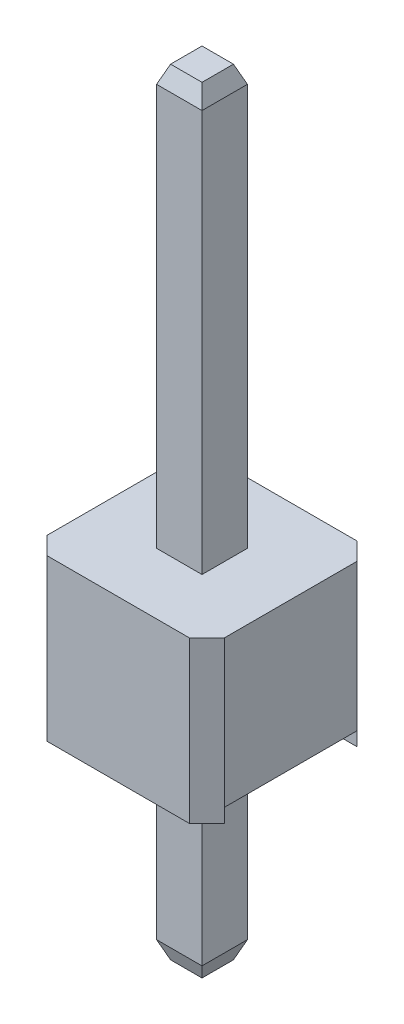
ISO-10303-21;
HEADER;
FILE_DESCRIPTION(('STEP AP214'),'2;1');
FILE_NAME('part.step','',(''),(''),'','','');
FILE_SCHEMA(('AUTOMOTIVE_DESIGN { 1 0 10303 214 1 1 1 1 }'));
ENDSEC;
DATA;
#1=APPLICATION_CONTEXT('core data for automotive mechanical design processes');
#2=APPLICATION_PROTOCOL_DEFINITION('international standard','automotive_design',2000,#1);
#3=PRODUCT_CONTEXT('',#1,'mechanical');
#4=PRODUCT('Part','Part','',(#3));
#5=PRODUCT_RELATED_PRODUCT_CATEGORY('part','',(#4));
#6=PRODUCT_DEFINITION_FORMATION('','',#4);
#7=PRODUCT_DEFINITION_CONTEXT('part definition',#1,'design');
#8=PRODUCT_DEFINITION('design','',#6,#7);
#9=PRODUCT_DEFINITION_SHAPE('','',#8);
#10=(LENGTH_UNIT() NAMED_UNIT(*) SI_UNIT(.MILLI.,.METRE.));
#11=(NAMED_UNIT(*) PLANE_ANGLE_UNIT() SI_UNIT($,.RADIAN.));
#12=(NAMED_UNIT(*) SI_UNIT($,.STERADIAN.) SOLID_ANGLE_UNIT());
#13=UNCERTAINTY_MEASURE_WITH_UNIT(LENGTH_MEASURE(1.E-05),#10,'distance_accuracy_value','');
#14=(GEOMETRIC_REPRESENTATION_CONTEXT(3) GLOBAL_UNCERTAINTY_ASSIGNED_CONTEXT((#13)) GLOBAL_UNIT_ASSIGNED_CONTEXT((#10,
#11,#12)) REPRESENTATION_CONTEXT('',''));
#15=CARTESIAN_POINT('',(0.,0.,0.));
#16=DIRECTION('',(0.,0.,1.));
#17=DIRECTION('',(1.,0.,0.));
#18=AXIS2_PLACEMENT_3D('',#15,#16,#17);
#19=CARTESIAN_POINT('',(-4.405,3.2,1.275));
#20=DIRECTION('',(0.,1.,0.));
#21=DIRECTION('',(0.,0.,1.));
#22=AXIS2_PLACEMENT_3D('',#19,#20,#21);
#23=PLANE('',#22);
#24=DIRECTION('',(0.,0.,-1.));
#25=VECTOR('',#24,1.);
#26=CARTESIAN_POINT('',(-0.945,3.2,-0.875));
#27=LINE('',#26,#25);
#28=CARTESIAN_POINT('',(-0.945000000000002,3.2,1.275));
#29=VERTEX_POINT('',#28);
#30=CARTESIAN_POINT('',(-0.945000000000005,3.2,-0.624999999999996));
#31=VERTEX_POINT('',#30);
#32=EDGE_CURVE('E230',#29,#31,#27,.T.);
#33=ORIENTED_EDGE('',*,*,#32,.T.);
#34=DIRECTION('',(1.,0.,0.));
#35=VECTOR('',#34,1.);
#36=CARTESIAN_POINT('',(-4.405,3.2,-0.624999999999996));
#37=LINE('',#36,#35);
#38=CARTESIAN_POINT('',(1.595,3.2,-0.624999999999996));
#39=VERTEX_POINT('',#38);
#40=EDGE_CURVE('E233',#31,#39,#37,.T.);
#41=ORIENTED_EDGE('',*,*,#40,.T.);
#42=DIRECTION('',(0.,0.,1.));
#43=VECTOR('',#42,1.);
#44=CARTESIAN_POINT('',(1.595,3.2,1.275));
#45=LINE('',#44,#43);
#46=CARTESIAN_POINT('',(1.595,3.2,1.275));
#47=VERTEX_POINT('',#46);
#48=EDGE_CURVE('E387',#39,#47,#45,.T.);
#49=ORIENTED_EDGE('',*,*,#48,.T.);
#50=DIRECTION('',(1.,0.,0.));
#51=VECTOR('',#50,1.);
#52=CARTESIAN_POINT('',(-4.405,3.2,1.275));
#53=LINE('',#52,#51);
#54=EDGE_CURVE('E303',#29,#47,#53,.T.);
#55=ORIENTED_EDGE('',*,*,#54,.F.);
#56=EDGE_LOOP('',(#33,#41,#49,#55));
#57=FACE_BOUND('',#56,.T.);
#58=DIRECTION('',(0.,0.,-1.));
#59=VECTOR('',#58,1.);
#60=CARTESIAN_POINT('',(0.,3.2,0.));
#61=LINE('',#60,#59);
#62=CARTESIAN_POINT('',(0.,3.2,0.65));
#63=VERTEX_POINT('',#62);
#64=CARTESIAN_POINT('',(0.,3.2,0.));
#65=VERTEX_POINT('',#64);
#66=EDGE_CURVE('E192',#63,#65,#61,.T.);
#67=ORIENTED_EDGE('',*,*,#66,.F.);
#68=DIRECTION('',(-1.,0.,0.));
#69=VECTOR('',#68,1.);
#70=CARTESIAN_POINT('',(0.,3.2,0.65));
#71=LINE('',#70,#69);
#72=CARTESIAN_POINT('',(0.65,3.2,0.65));
#73=VERTEX_POINT('',#72);
#74=EDGE_CURVE('E200',#73,#63,#71,.T.);
#75=ORIENTED_EDGE('',*,*,#74,.F.);
#76=DIRECTION('',(0.,0.,1.));
#77=VECTOR('',#76,1.);
#78=CARTESIAN_POINT('',(0.65,3.2,0.));
#79=LINE('',#78,#77);
#80=CARTESIAN_POINT('',(0.65,3.2,0.));
#81=VERTEX_POINT('',#80);
#82=EDGE_CURVE('E213',#81,#73,#79,.T.);
#83=ORIENTED_EDGE('',*,*,#82,.F.);
#84=DIRECTION('',(1.,0.,0.));
#85=VECTOR('',#84,1.);
#86=CARTESIAN_POINT('',(0.,3.2,0.));
#87=LINE('',#86,#85);
#88=EDGE_CURVE('E208',#65,#81,#87,.T.);
#89=ORIENTED_EDGE('',*,*,#88,.F.);
#90=EDGE_LOOP('',(#67,#75,#83,#89));
#91=FACE_BOUND('',#90,.T.);
#92=ADVANCED_FACE('F38',(#57,#91),#23,.F.);
#93=CARTESIAN_POINT('',(0.,3.,0.));
#94=DIRECTION('',(0.,-1.,0.));
#95=DIRECTION('',(0.,0.,-1.));
#96=AXIS2_PLACEMENT_3D('',#93,#94,#95);
#97=PLANE('',#96);
#98=DIRECTION('',(1.,0.,0.));
#99=VECTOR('',#98,1.);
#100=CARTESIAN_POINT('',(-4.405,3.,1.275));
#101=LINE('',#100,#99);
#102=CARTESIAN_POINT('',(-0.945000000000002,3.,1.275));
#103=VERTEX_POINT('',#102);
#104=CARTESIAN_POINT('',(1.595,3.,1.275));
#105=VERTEX_POINT('',#104);
#106=EDGE_CURVE('E229',#103,#105,#101,.T.);
#107=ORIENTED_EDGE('',*,*,#106,.T.);
#108=DIRECTION('',(0.70710678118655,0.,-0.707106781186545));
#109=VECTOR('',#108,1.);
#110=CARTESIAN_POINT('',(1.43499999999999,3.,1.435));
#111=LINE('',#110,#109);
#112=CARTESIAN_POINT('',(1.345,3.,1.525));
#113=VERTEX_POINT('',#112);
#114=EDGE_CURVE('E290',#105,#113,#111,.F.);
#115=ORIENTED_EDGE('',*,*,#114,.T.);
#116=DIRECTION('',(-1.,0.,0.));
#117=VECTOR('',#116,1.);
#118=CARTESIAN_POINT('',(1.595,3.,1.525));
#119=LINE('',#118,#117);
#120=CARTESIAN_POINT('',(-0.695,3.,1.525));
#121=VERTEX_POINT('',#120);
#122=EDGE_CURVE('E289',#113,#121,#119,.T.);
#123=ORIENTED_EDGE('',*,*,#122,.T.);
#124=DIRECTION('',(0.707106781186548,0.,0.707106781186548));
#125=VECTOR('',#124,1.);
#126=CARTESIAN_POINT('',(-1.11,3.,1.11));
#127=LINE('',#126,#125);
#128=EDGE_CURVE('E284',#121,#103,#127,.F.);
#129=ORIENTED_EDGE('',*,*,#128,.T.);
#130=EDGE_LOOP('',(#107,#115,#123,#129));
#131=FACE_BOUND('',#130,.T.);
#132=ADVANCED_FACE('F463',(#131),#97,.T.);
#133=CARTESIAN_POINT('',(0.,11.3,0.));
#134=DIRECTION('',(1.,0.,0.));
#135=DIRECTION('',(0.,0.,-1.));
#136=AXIS2_PLACEMENT_3D('',#133,#134,#135);
#137=PLANE('',#136);
#138=DIRECTION('',(0.,0.,-1.));
#139=VECTOR('',#138,1.);
#140=CARTESIAN_POINT('',(0.,5.3,0.));
#141=LINE('',#140,#139);
#142=CARTESIAN_POINT('',(0.,5.3,0.65));
#143=VERTEX_POINT('',#142);
#144=CARTESIAN_POINT('',(0.,5.3,0.));
#145=VERTEX_POINT('',#144);
#146=EDGE_CURVE('E308',#143,#145,#141,.T.);
#147=ORIENTED_EDGE('',*,*,#146,.F.);
#148=DIRECTION('',(0.,-1.,0.));
#149=VECTOR('',#148,1.);
#150=CARTESIAN_POINT('',(0.,11.3,0.65));
#151=LINE('',#150,#149);
#152=CARTESIAN_POINT('',(0.,11.05,0.65));
#153=VERTEX_POINT('',#152);
#154=EDGE_CURVE('E329',#153,#143,#151,.T.);
#155=ORIENTED_EDGE('',*,*,#154,.F.);
#156=DIRECTION('',(0.,0.,-1.));
#157=VECTOR('',#156,1.);
#158=CARTESIAN_POINT('',(0.,11.05,0.));
#159=LINE('',#158,#157);
#160=CARTESIAN_POINT('',(0.,11.05,0.));
#161=VERTEX_POINT('',#160);
#162=EDGE_CURVE('E288',#153,#161,#159,.T.);
#163=ORIENTED_EDGE('',*,*,#162,.T.);
#164=DIRECTION('',(0.,-1.,0.));
#165=VECTOR('',#164,1.);
#166=CARTESIAN_POINT('',(0.,11.3,0.));
#167=LINE('',#166,#165);
#168=EDGE_CURVE('E325',#161,#145,#167,.T.);
#169=ORIENTED_EDGE('',*,*,#168,.T.);
#170=EDGE_LOOP('',(#147,#155,#163,#169));
#171=FACE_BOUND('',#170,.T.);
#172=ADVANCED_FACE('F469',(#171),#137,.F.);
#173=CARTESIAN_POINT('',(0.,11.3,0.65));
#174=DIRECTION('',(0.,0.,-1.));
#175=DIRECTION('',(-1.,0.,0.));
#176=AXIS2_PLACEMENT_3D('',#173,#174,#175);
#177=PLANE('',#176);
#178=DIRECTION('',(-1.,0.,0.));
#179=VECTOR('',#178,1.);
#180=CARTESIAN_POINT('',(0.,5.3,0.65));
#181=LINE('',#180,#179);
#182=CARTESIAN_POINT('',(0.65,5.3,0.65));
#183=VERTEX_POINT('',#182);
#184=EDGE_CURVE('E270',#183,#143,#181,.T.);
#185=ORIENTED_EDGE('',*,*,#184,.F.);
#186=DIRECTION('',(0.,-1.,0.));
#187=VECTOR('',#186,1.);
#188=CARTESIAN_POINT('',(0.65,11.3,0.65));
#189=LINE('',#188,#187);
#190=CARTESIAN_POINT('',(0.65,11.05,0.65));
#191=VERTEX_POINT('',#190);
#192=EDGE_CURVE('E333',#191,#183,#189,.T.);
#193=ORIENTED_EDGE('',*,*,#192,.F.);
#194=DIRECTION('',(-1.,0.,0.));
#195=VECTOR('',#194,1.);
#196=CARTESIAN_POINT('',(0.,11.05,0.65));
#197=LINE('',#196,#195);
#198=EDGE_CURVE('E326',#191,#153,#197,.T.);
#199=ORIENTED_EDGE('',*,*,#198,.T.);
#200=ORIENTED_EDGE('',*,*,#154,.T.);
#201=EDGE_LOOP('',(#185,#193,#199,#200));
#202=FACE_BOUND('',#201,.T.);
#203=ADVANCED_FACE('F479',(#202),#177,.F.);
#204=CARTESIAN_POINT('',(0.65,11.3,0.));
#205=DIRECTION('',(-1.,0.,0.));
#206=DIRECTION('',(0.,0.,1.));
#207=AXIS2_PLACEMENT_3D('',#204,#205,#206);
#208=PLANE('',#207);
#209=DIRECTION('',(0.,0.,1.));
#210=VECTOR('',#209,1.);
#211=CARTESIAN_POINT('',(0.65,5.3,0.));
#212=LINE('',#211,#210);
#213=CARTESIAN_POINT('',(0.65,5.3,0.));
#214=VERTEX_POINT('',#213);
#215=EDGE_CURVE('E283',#214,#183,#212,.T.);
#216=ORIENTED_EDGE('',*,*,#215,.F.);
#217=DIRECTION('',(0.,-1.,0.));
#218=VECTOR('',#217,1.);
#219=CARTESIAN_POINT('',(0.65,11.3,0.));
#220=LINE('',#219,#218);
#221=CARTESIAN_POINT('',(0.65,11.05,0.));
#222=VERTEX_POINT('',#221);
#223=EDGE_CURVE('E338',#222,#214,#220,.T.);
#224=ORIENTED_EDGE('',*,*,#223,.F.);
#225=DIRECTION('',(0.,0.,1.));
#226=VECTOR('',#225,1.);
#227=CARTESIAN_POINT('',(0.65,11.05,0.65));
#228=LINE('',#227,#226);
#229=EDGE_CURVE('E330',#222,#191,#228,.T.);
#230=ORIENTED_EDGE('',*,*,#229,.T.);
#231=ORIENTED_EDGE('',*,*,#192,.T.);
#232=EDGE_LOOP('',(#216,#224,#230,#231));
#233=FACE_BOUND('',#232,.T.);
#234=ADVANCED_FACE('F483',(#233),#208,.F.);
#235=CARTESIAN_POINT('',(0.,11.3,0.));
#236=DIRECTION('',(0.,0.,1.));
#237=DIRECTION('',(1.,0.,0.));
#238=AXIS2_PLACEMENT_3D('',#235,#236,#237);
#239=PLANE('',#238);
#240=DIRECTION('',(1.,0.,0.));
#241=VECTOR('',#240,1.);
#242=CARTESIAN_POINT('',(0.,5.3,0.));
#243=LINE('',#242,#241);
#244=EDGE_CURVE('E304',#145,#214,#243,.T.);
#245=ORIENTED_EDGE('',*,*,#244,.F.);
#246=ORIENTED_EDGE('',*,*,#168,.F.);
#247=DIRECTION('',(1.,0.,0.));
#248=VECTOR('',#247,1.);
#249=CARTESIAN_POINT('',(0.65,11.05,0.));
#250=LINE('',#249,#248);
#251=EDGE_CURVE('E334',#161,#222,#250,.T.);
#252=ORIENTED_EDGE('',*,*,#251,.T.);
#253=ORIENTED_EDGE('',*,*,#223,.T.);
#254=EDGE_LOOP('',(#245,#246,#252,#253));
#255=FACE_BOUND('',#254,.T.);
#256=ADVANCED_FACE('F487',(#255),#239,.F.);
#257=CARTESIAN_POINT('',(0.,11.3,0.));
#258=DIRECTION('',(0.,1.,0.));
#259=DIRECTION('',(0.,0.,1.));
#260=AXIS2_PLACEMENT_3D('',#257,#258,#259);
#261=PLANE('',#260);
#262=DIRECTION('',(0.,0.,-1.));
#263=VECTOR('',#262,1.);
#264=CARTESIAN_POINT('',(0.55,11.3,0.));
#265=LINE('',#264,#263);
#266=CARTESIAN_POINT('',(0.55,11.3,0.55));
#267=VERTEX_POINT('',#266);
#268=CARTESIAN_POINT('',(0.55,11.3,0.1));
#269=VERTEX_POINT('',#268);
#270=EDGE_CURVE('E344',#267,#269,#265,.T.);
#271=ORIENTED_EDGE('',*,*,#270,.T.);
#272=DIRECTION('',(-1.,0.,0.));
#273=VECTOR('',#272,1.);
#274=CARTESIAN_POINT('',(0.,11.3,0.1));
#275=LINE('',#274,#273);
#276=CARTESIAN_POINT('',(0.1,11.3,0.1));
#277=VERTEX_POINT('',#276);
#278=EDGE_CURVE('E339',#269,#277,#275,.T.);
#279=ORIENTED_EDGE('',*,*,#278,.T.);
#280=DIRECTION('',(0.,0.,1.));
#281=VECTOR('',#280,1.);
#282=CARTESIAN_POINT('',(0.1,11.3,0.65));
#283=LINE('',#282,#281);
#284=CARTESIAN_POINT('',(0.1,11.3,0.55));
#285=VERTEX_POINT('',#284);
#286=EDGE_CURVE('E343',#277,#285,#283,.T.);
#287=ORIENTED_EDGE('',*,*,#286,.T.);
#288=DIRECTION('',(1.,0.,0.));
#289=VECTOR('',#288,1.);
#290=CARTESIAN_POINT('',(0.65,11.3,0.55));
#291=LINE('',#290,#289);
#292=EDGE_CURVE('E314',#285,#267,#291,.T.);
#293=ORIENTED_EDGE('',*,*,#292,.T.);
#294=EDGE_LOOP('',(#271,#279,#287,#293));
#295=FACE_BOUND('',#294,.T.);
#296=ADVANCED_FACE('F491',(#295),#261,.T.);
#297=CARTESIAN_POINT('',(0.,11.3,0.55));
#298=DIRECTION('',(0.,0.371390676354102,0.92847669088526));
#299=DIRECTION('',(-1.,0.,0.));
#300=AXIS2_PLACEMENT_3D('',#297,#298,#299);
#301=PLANE('',#300);
#302=DIRECTION('',(0.348155311911394,0.87038827977849,-0.348155311911394));
#303=VECTOR('',#302,1.);
#304=CARTESIAN_POINT('',(0.166666666666666,11.4666666666667,0.483333333333334));
#305=LINE('',#304,#303);
#306=EDGE_CURVE('E313',#153,#285,#305,.T.);
#307=ORIENTED_EDGE('',*,*,#306,.F.);
#308=ORIENTED_EDGE('',*,*,#198,.F.);
#309=DIRECTION('',(-0.348155311911394,0.87038827977849,-0.348155311911394));
#310=VECTOR('',#309,1.);
#311=CARTESIAN_POINT('',(0.483333333333334,11.4666666666667,0.483333333333334));
#312=LINE('',#311,#310);
#313=EDGE_CURVE('E309',#267,#191,#312,.F.);
#314=ORIENTED_EDGE('',*,*,#313,.F.);
#315=ORIENTED_EDGE('',*,*,#292,.F.);
#316=EDGE_LOOP('',(#307,#308,#314,#315));
#317=FACE_BOUND('',#316,.T.);
#318=ADVANCED_FACE('F652',(#317),#301,.T.);
#319=CARTESIAN_POINT('',(0.55,11.3,0.));
#320=DIRECTION('',(0.92847669088526,0.371390676354102,0.));
#321=DIRECTION('',(0.,0.,1.));
#322=AXIS2_PLACEMENT_3D('',#319,#320,#321);
#323=PLANE('',#322);
#324=ORIENTED_EDGE('',*,*,#313,.T.);
#325=ORIENTED_EDGE('',*,*,#229,.F.);
#326=DIRECTION('',(-0.348155311911394,0.87038827977849,0.348155311911394));
#327=VECTOR('',#326,1.);
#328=CARTESIAN_POINT('',(0.562121212121212,11.269696969697,0.0878787878787882));
#329=LINE('',#328,#327);
#330=EDGE_CURVE('E318',#269,#222,#329,.F.);
#331=ORIENTED_EDGE('',*,*,#330,.F.);
#332=ORIENTED_EDGE('',*,*,#270,.F.);
#333=EDGE_LOOP('',(#324,#325,#331,#332));
#334=FACE_BOUND('',#333,.T.);
#335=ADVANCED_FACE('F643',(#334),#323,.T.);
#336=CARTESIAN_POINT('',(0.1,11.3,0.));
#337=DIRECTION('',(-0.92847669088526,0.371390676354102,0.));
#338=DIRECTION('',(0.,0.,-1.));
#339=AXIS2_PLACEMENT_3D('',#336,#337,#338);
#340=PLANE('',#339);
#341=ORIENTED_EDGE('',*,*,#306,.T.);
#342=ORIENTED_EDGE('',*,*,#286,.F.);
#343=DIRECTION('',(-0.348155311911394,-0.87038827977849,-0.348155311911394));
#344=VECTOR('',#343,1.);
#345=CARTESIAN_POINT('',(0.0878787878787882,11.269696969697,0.0878787878787882));
#346=LINE('',#345,#344);
#347=EDGE_CURVE('E261',#161,#277,#346,.F.);
#348=ORIENTED_EDGE('',*,*,#347,.F.);
#349=ORIENTED_EDGE('',*,*,#162,.F.);
#350=EDGE_LOOP('',(#341,#342,#348,#349));
#351=FACE_BOUND('',#350,.T.);
#352=ADVANCED_FACE('F634',(#351),#340,.T.);
#353=CARTESIAN_POINT('',(0.,11.3,0.1));
#354=DIRECTION('',(0.,0.371390676354102,-0.92847669088526));
#355=DIRECTION('',(1.,0.,0.));
#356=AXIS2_PLACEMENT_3D('',#353,#354,#355);
#357=PLANE('',#356);
#358=ORIENTED_EDGE('',*,*,#330,.T.);
#359=ORIENTED_EDGE('',*,*,#251,.F.);
#360=ORIENTED_EDGE('',*,*,#347,.T.);
#361=ORIENTED_EDGE('',*,*,#278,.F.);
#362=EDGE_LOOP('',(#358,#359,#360,#361));
#363=FACE_BOUND('',#362,.T.);
#364=ADVANCED_FACE('F625',(#363),#357,.T.);
#365=CARTESIAN_POINT('',(0.,5.3,0.));
#366=DIRECTION('',(0.,-1.,0.));
#367=DIRECTION('',(0.,0.,-1.));
#368=AXIS2_PLACEMENT_3D('',#365,#366,#367);
#369=PLANE('',#368);
#370=DIRECTION('',(1.,0.,0.));
#371=VECTOR('',#370,1.);
#372=CARTESIAN_POINT('',(1.595,5.3,-0.875));
#373=LINE('',#372,#371);
#374=CARTESIAN_POINT('',(-0.695000000000001,5.3,-0.875));
#375=VERTEX_POINT('',#374);
#376=CARTESIAN_POINT('',(1.345,5.3,-0.875));
#377=VERTEX_POINT('',#376);
#378=EDGE_CURVE('E273',#375,#377,#373,.T.);
#379=ORIENTED_EDGE('',*,*,#378,.F.);
#380=DIRECTION('',(0.707106781186548,0.,-0.707106781186548));
#381=VECTOR('',#380,1.);
#382=CARTESIAN_POINT('',(-0.945,5.3,-0.625000000000001));
#383=LINE('',#382,#381);
#384=CARTESIAN_POINT('',(-0.945,5.3,-0.625000000000001));
#385=VERTEX_POINT('',#384);
#386=EDGE_CURVE('E257',#375,#385,#383,.F.);
#387=ORIENTED_EDGE('',*,*,#386,.T.);
#388=DIRECTION('',(0.,0.,-1.));
#389=VECTOR('',#388,1.);
#390=CARTESIAN_POINT('',(-0.945,5.3,-0.875));
#391=LINE('',#390,#389);
#392=CARTESIAN_POINT('',(-0.945,5.3,1.275));
#393=VERTEX_POINT('',#392);
#394=EDGE_CURVE('E300',#393,#385,#391,.T.);
#395=ORIENTED_EDGE('',*,*,#394,.F.);
#396=DIRECTION('',(-0.707106781186548,0.,-0.707106781186548));
#397=VECTOR('',#396,1.);
#398=CARTESIAN_POINT('',(-0.695,5.3,1.525));
#399=LINE('',#398,#397);
#400=CARTESIAN_POINT('',(-0.695,5.3,1.525));
#401=VERTEX_POINT('',#400);
#402=EDGE_CURVE('E260',#393,#401,#399,.F.);
#403=ORIENTED_EDGE('',*,*,#402,.T.);
#404=DIRECTION('',(-1.,0.,0.));
#405=VECTOR('',#404,1.);
#406=CARTESIAN_POINT('',(1.595,5.3,1.525));
#407=LINE('',#406,#405);
#408=CARTESIAN_POINT('',(1.345,5.3,1.525));
#409=VERTEX_POINT('',#408);
#410=EDGE_CURVE('E253',#409,#401,#407,.T.);
#411=ORIENTED_EDGE('',*,*,#410,.F.);
#412=DIRECTION('',(-0.70710678118655,0.,0.707106781186545));
#413=VECTOR('',#412,1.);
#414=CARTESIAN_POINT('',(1.595,5.3,1.275));
#415=LINE('',#414,#413);
#416=CARTESIAN_POINT('',(1.595,5.3,1.275));
#417=VERTEX_POINT('',#416);
#418=EDGE_CURVE('E264',#409,#417,#415,.F.);
#419=ORIENTED_EDGE('',*,*,#418,.T.);
#420=DIRECTION('',(0.,0.,1.));
#421=VECTOR('',#420,1.);
#422=CARTESIAN_POINT('',(1.595,5.3,-0.875));
#423=LINE('',#422,#421);
#424=CARTESIAN_POINT('',(1.595,5.3,-0.624999999999996));
#425=VERTEX_POINT('',#424);
#426=EDGE_CURVE('E240',#425,#417,#423,.T.);
#427=ORIENTED_EDGE('',*,*,#426,.F.);
#428=DIRECTION('',(0.707106781186545,0.,0.70710678118655));
#429=VECTOR('',#428,1.);
#430=CARTESIAN_POINT('',(1.345,5.3,-0.875));
#431=LINE('',#430,#429);
#432=EDGE_CURVE('E267',#425,#377,#431,.F.);
#433=ORIENTED_EDGE('',*,*,#432,.T.);
#434=EDGE_LOOP('',(#379,#387,#395,#403,#411,#419,#427,#433));
#435=FACE_BOUND('',#434,.T.);
#436=ORIENTED_EDGE('',*,*,#184,.T.);
#437=ORIENTED_EDGE('',*,*,#146,.T.);
#438=ORIENTED_EDGE('',*,*,#244,.T.);
#439=ORIENTED_EDGE('',*,*,#215,.T.);
#440=EDGE_LOOP('',(#436,#437,#438,#439));
#441=FACE_BOUND('',#440,.T.);
#442=ADVANCED_FACE('F617',(#435,#441),#369,.F.);
#443=DIRECTION('',(1.,0.,0.));
#444=VECTOR('',#443,1.);
#445=CARTESIAN_POINT('',(-4.405,3.,-0.624999999999996));
#446=LINE('',#445,#444);
#447=CARTESIAN_POINT('',(-0.945000000000005,3.,-0.624999999999996));
#448=VERTEX_POINT('',#447);
#449=CARTESIAN_POINT('',(1.595,3.,-0.624999999999996));
#450=VERTEX_POINT('',#449);
#451=EDGE_CURVE('E246',#448,#450,#446,.T.);
#452=ORIENTED_EDGE('',*,*,#451,.F.);
#453=DIRECTION('',(-0.707106781186548,0.,0.707106781186548));
#454=VECTOR('',#453,1.);
#455=CARTESIAN_POINT('',(-0.785000000000001,3.,-0.785000000000001));
#456=LINE('',#455,#454);
#457=CARTESIAN_POINT('',(-0.695000000000001,3.,-0.875));
#458=VERTEX_POINT('',#457);
#459=EDGE_CURVE('E279',#448,#458,#456,.F.);
#460=ORIENTED_EDGE('',*,*,#459,.T.);
#461=DIRECTION('',(1.,0.,0.));
#462=VECTOR('',#461,1.);
#463=CARTESIAN_POINT('',(1.595,3.,-0.875));
#464=LINE('',#463,#462);
#465=CARTESIAN_POINT('',(1.345,3.,-0.875));
#466=VERTEX_POINT('',#465);
#467=EDGE_CURVE('E282',#458,#466,#464,.T.);
#468=ORIENTED_EDGE('',*,*,#467,.T.);
#469=DIRECTION('',(-0.707106781186545,0.,-0.70710678118655));
#470=VECTOR('',#469,1.);
#471=CARTESIAN_POINT('',(1.11,3.,-1.11));
#472=LINE('',#471,#470);
#473=EDGE_CURVE('E292',#466,#450,#472,.F.);
#474=ORIENTED_EDGE('',*,*,#473,.T.);
#475=EDGE_LOOP('',(#452,#460,#468,#474));
#476=FACE_BOUND('',#475,.T.);
#477=ADVANCED_FACE('F472',(#476),#97,.T.);
#478=CARTESIAN_POINT('',(1.595,5.3,-0.875));
#479=DIRECTION('',(1.,0.,0.));
#480=DIRECTION('',(0.,0.,-1.));
#481=AXIS2_PLACEMENT_3D('',#478,#479,#480);
#482=PLANE('',#481);
#483=ORIENTED_EDGE('',*,*,#48,.F.);
#484=DIRECTION('',(0.,1.,0.));
#485=VECTOR('',#484,1.);
#486=CARTESIAN_POINT('',(1.595,5.3,-0.624999999999996));
#487=LINE('',#486,#485);
#488=EDGE_CURVE('E247',#39,#425,#487,.T.);
#489=ORIENTED_EDGE('',*,*,#488,.T.);
#490=ORIENTED_EDGE('',*,*,#426,.T.);
#491=DIRECTION('',(0.,-1.,0.));
#492=VECTOR('',#491,1.);
#493=CARTESIAN_POINT('',(1.595,5.3,1.275));
#494=LINE('',#493,#492);
#495=EDGE_CURVE('E235',#417,#47,#494,.T.);
#496=ORIENTED_EDGE('',*,*,#495,.T.);
#497=EDGE_LOOP('',(#483,#489,#490,#496));
#498=FACE_BOUND('',#497,.T.);
#499=ADVANCED_FACE('F600',(#498),#482,.T.);
#500=CARTESIAN_POINT('',(1.595,5.3,-0.875));
#501=DIRECTION('',(0.,0.,-1.));
#502=DIRECTION('',(-1.,0.,0.));
#503=AXIS2_PLACEMENT_3D('',#500,#501,#502);
#504=PLANE('',#503);
#505=ORIENTED_EDGE('',*,*,#467,.F.);
#506=DIRECTION('',(0.,1.,0.));
#507=VECTOR('',#506,1.);
#508=CARTESIAN_POINT('',(-0.695000000000001,5.3,-0.875));
#509=LINE('',#508,#507);
#510=EDGE_CURVE('E239',#458,#375,#509,.T.);
#511=ORIENTED_EDGE('',*,*,#510,.T.);
#512=ORIENTED_EDGE('',*,*,#378,.T.);
#513=DIRECTION('',(0.,-1.,0.));
#514=VECTOR('',#513,1.);
#515=CARTESIAN_POINT('',(1.345,5.3,-0.875));
#516=LINE('',#515,#514);
#517=EDGE_CURVE('E274',#377,#466,#516,.T.);
#518=ORIENTED_EDGE('',*,*,#517,.T.);
#519=EDGE_LOOP('',(#505,#511,#512,#518));
#520=FACE_BOUND('',#519,.T.);
#521=ADVANCED_FACE('F591',(#520),#504,.T.);
#522=CARTESIAN_POINT('',(-0.945,5.3,-0.875));
#523=DIRECTION('',(-1.,0.,0.));
#524=DIRECTION('',(0.,0.,1.));
#525=AXIS2_PLACEMENT_3D('',#522,#523,#524);
#526=PLANE('',#525);
#527=ORIENTED_EDGE('',*,*,#32,.F.);
#528=DIRECTION('',(0.,1.,0.));
#529=VECTOR('',#528,1.);
#530=CARTESIAN_POINT('',(-0.945,5.3,1.275));
#531=LINE('',#530,#529);
#532=EDGE_CURVE('E278',#29,#393,#531,.T.);
#533=ORIENTED_EDGE('',*,*,#532,.T.);
#534=ORIENTED_EDGE('',*,*,#394,.T.);
#535=DIRECTION('',(0.,-1.,0.));
#536=VECTOR('',#535,1.);
#537=CARTESIAN_POINT('',(-0.945,5.3,-0.625000000000001));
#538=LINE('',#537,#536);
#539=EDGE_CURVE('E296',#385,#31,#538,.T.);
#540=ORIENTED_EDGE('',*,*,#539,.T.);
#541=EDGE_LOOP('',(#527,#533,#534,#540));
#542=FACE_BOUND('',#541,.T.);
#543=ADVANCED_FACE('F582',(#542),#526,.T.);
#544=CARTESIAN_POINT('',(1.595,5.3,1.525));
#545=DIRECTION('',(0.,0.,1.));
#546=DIRECTION('',(1.,0.,0.));
#547=AXIS2_PLACEMENT_3D('',#544,#545,#546);
#548=PLANE('',#547);
#549=ORIENTED_EDGE('',*,*,#410,.T.);
#550=DIRECTION('',(0.,-1.,0.));
#551=VECTOR('',#550,1.);
#552=CARTESIAN_POINT('',(-0.695,5.3,1.525));
#553=LINE('',#552,#551);
#554=EDGE_CURVE('E248',#401,#121,#553,.T.);
#555=ORIENTED_EDGE('',*,*,#554,.T.);
#556=ORIENTED_EDGE('',*,*,#122,.F.);
#557=DIRECTION('',(0.,1.,0.));
#558=VECTOR('',#557,1.);
#559=CARTESIAN_POINT('',(1.345,5.3,1.525));
#560=LINE('',#559,#558);
#561=EDGE_CURVE('E252',#113,#409,#560,.T.);
#562=ORIENTED_EDGE('',*,*,#561,.T.);
#563=EDGE_LOOP('',(#549,#555,#556,#562));
#564=FACE_BOUND('',#563,.T.);
#565=ADVANCED_FACE('F573',(#564),#548,.T.);
#566=CARTESIAN_POINT('',(-0.945,5.3,-0.625000000000001));
#567=DIRECTION('',(0.707106781186547,0.,0.707106781186547));
#568=DIRECTION('',(0.,-1.,0.));
#569=AXIS2_PLACEMENT_3D('',#566,#567,#568);
#570=PLANE('',#569);
#571=ORIENTED_EDGE('',*,*,#386,.F.);
#572=ORIENTED_EDGE('',*,*,#510,.F.);
#573=ORIENTED_EDGE('',*,*,#459,.F.);
#574=DIRECTION('',(0.,1.,0.));
#575=VECTOR('',#574,1.);
#576=CARTESIAN_POINT('',(-0.945000000000005,5.3,-0.624999999999996));
#577=LINE('',#576,#575);
#578=EDGE_CURVE('E256',#31,#448,#577,.F.);
#579=ORIENTED_EDGE('',*,*,#578,.F.);
#580=ORIENTED_EDGE('',*,*,#539,.F.);
#581=EDGE_LOOP('',(#571,#572,#573,#579,#580));
#582=FACE_BOUND('',#581,.T.);
#583=ADVANCED_FACE('F564',(#582),#570,.F.);
#584=CARTESIAN_POINT('',(-0.695,5.3,1.525));
#585=DIRECTION('',(0.707106781186547,0.,-0.707106781186547));
#586=DIRECTION('',(0.,-1.,0.));
#587=AXIS2_PLACEMENT_3D('',#584,#585,#586);
#588=PLANE('',#587);
#589=ORIENTED_EDGE('',*,*,#402,.F.);
#590=ORIENTED_EDGE('',*,*,#532,.F.);
#591=EDGE_CURVE('E245',#103,#29,#531,.T.);
#592=ORIENTED_EDGE('',*,*,#591,.F.);
#593=ORIENTED_EDGE('',*,*,#128,.F.);
#594=ORIENTED_EDGE('',*,*,#554,.F.);
#595=EDGE_LOOP('',(#589,#590,#592,#593,#594));
#596=FACE_BOUND('',#595,.T.);
#597=ADVANCED_FACE('F555',(#596),#588,.F.);
#598=CARTESIAN_POINT('',(1.595,5.3,1.275));
#599=DIRECTION('',(-0.707106781186545,0.,-0.70710678118655));
#600=DIRECTION('',(0.,-1.,0.));
#601=AXIS2_PLACEMENT_3D('',#598,#599,#600);
#602=PLANE('',#601);
#603=ORIENTED_EDGE('',*,*,#418,.F.);
#604=ORIENTED_EDGE('',*,*,#561,.F.);
#605=ORIENTED_EDGE('',*,*,#114,.F.);
#606=DIRECTION('',(0.,-1.,0.));
#607=VECTOR('',#606,1.);
#608=CARTESIAN_POINT('',(1.595,3.,1.275));
#609=LINE('',#608,#607);
#610=EDGE_CURVE('E234',#47,#105,#609,.T.);
#611=ORIENTED_EDGE('',*,*,#610,.F.);
#612=ORIENTED_EDGE('',*,*,#495,.F.);
#613=EDGE_LOOP('',(#603,#604,#605,#611,#612));
#614=FACE_BOUND('',#613,.T.);
#615=ADVANCED_FACE('F546',(#614),#602,.F.);
#616=CARTESIAN_POINT('',(1.345,5.3,-0.875));
#617=DIRECTION('',(-0.70710678118655,0.,0.707106781186545));
#618=DIRECTION('',(0.,-1.,0.));
#619=AXIS2_PLACEMENT_3D('',#616,#617,#618);
#620=PLANE('',#619);
#621=ORIENTED_EDGE('',*,*,#432,.F.);
#622=ORIENTED_EDGE('',*,*,#488,.F.);
#623=EDGE_CURVE('E241',#450,#39,#487,.T.);
#624=ORIENTED_EDGE('',*,*,#623,.F.);
#625=ORIENTED_EDGE('',*,*,#473,.F.);
#626=ORIENTED_EDGE('',*,*,#517,.F.);
#627=EDGE_LOOP('',(#621,#622,#624,#625,#626));
#628=FACE_BOUND('',#627,.T.);
#629=ADVANCED_FACE('F538',(#628),#620,.F.);
#630=CARTESIAN_POINT('',(-4.405,3.,-0.624999999999996));
#631=DIRECTION('',(0.,0.,-1.));
#632=DIRECTION('',(-1.,0.,0.));
#633=AXIS2_PLACEMENT_3D('',#630,#631,#632);
#634=PLANE('',#633);
#635=ORIENTED_EDGE('',*,*,#578,.T.);
#636=ORIENTED_EDGE('',*,*,#451,.T.);
#637=ORIENTED_EDGE('',*,*,#623,.T.);
#638=ORIENTED_EDGE('',*,*,#40,.F.);
#639=EDGE_LOOP('',(#635,#636,#637,#638));
#640=FACE_BOUND('',#639,.T.);
#641=ADVANCED_FACE('F475',(#640),#634,.F.);
#642=CARTESIAN_POINT('',(-4.405,3.,1.275));
#643=DIRECTION('',(0.,0.,1.));
#644=DIRECTION('',(1.,0.,0.));
#645=AXIS2_PLACEMENT_3D('',#642,#643,#644);
#646=PLANE('',#645);
#647=ORIENTED_EDGE('',*,*,#591,.T.);
#648=ORIENTED_EDGE('',*,*,#54,.T.);
#649=ORIENTED_EDGE('',*,*,#610,.T.);
#650=ORIENTED_EDGE('',*,*,#106,.F.);
#651=EDGE_LOOP('',(#647,#648,#649,#650));
#652=FACE_BOUND('',#651,.T.);
#653=ADVANCED_FACE('F460',(#652),#646,.F.);
#654=CARTESIAN_POINT('',(0.,0.2,0.));
#655=DIRECTION('',(1.,0.,0.));
#656=DIRECTION('',(0.,0.,-1.));
#657=AXIS2_PLACEMENT_3D('',#654,#655,#656);
#658=PLANE('',#657);
#659=DIRECTION('',(0.,1.,0.));
#660=VECTOR('',#659,1.);
#661=CARTESIAN_POINT('',(0.,0.2,0.));
#662=LINE('',#661,#660);
#663=CARTESIAN_POINT('',(0.,0.450000000000002,0.));
#664=VERTEX_POINT('',#663);
#665=EDGE_CURVE('E226',#664,#65,#662,.T.);
#666=ORIENTED_EDGE('',*,*,#665,.F.);
#667=DIRECTION('',(0.,0.,1.));
#668=VECTOR('',#667,1.);
#669=CARTESIAN_POINT('',(0.,0.450000000000002,0.));
#670=LINE('',#669,#668);
#671=CARTESIAN_POINT('',(0.,0.450000000000002,0.65));
#672=VERTEX_POINT('',#671);
#673=EDGE_CURVE('E11',#664,#672,#670,.T.);
#674=ORIENTED_EDGE('',*,*,#673,.T.);
#675=DIRECTION('',(0.,1.,0.));
#676=VECTOR('',#675,1.);
#677=CARTESIAN_POINT('',(0.,0.2,0.65));
#678=LINE('',#677,#676);
#679=EDGE_CURVE('E189',#672,#63,#678,.T.);
#680=ORIENTED_EDGE('',*,*,#679,.T.);
#681=ORIENTED_EDGE('',*,*,#66,.T.);
#682=EDGE_LOOP('',(#666,#674,#680,#681));
#683=FACE_BOUND('',#682,.T.);
#684=ADVANCED_FACE('F191',(#683),#658,.F.);
#685=CARTESIAN_POINT('',(0.,0.2,0.));
#686=DIRECTION('',(0.,0.,1.));
#687=DIRECTION('',(1.,0.,0.));
#688=AXIS2_PLACEMENT_3D('',#685,#686,#687);
#689=PLANE('',#688);
#690=DIRECTION('',(0.,1.,0.));
#691=VECTOR('',#690,1.);
#692=CARTESIAN_POINT('',(0.65,0.2,0.));
#693=LINE('',#692,#691);
#694=CARTESIAN_POINT('',(0.65,0.450000000000002,0.));
#695=VERTEX_POINT('',#694);
#696=EDGE_CURVE('E223',#695,#81,#693,.T.);
#697=ORIENTED_EDGE('',*,*,#696,.F.);
#698=DIRECTION('',(-1.,0.,0.));
#699=VECTOR('',#698,1.);
#700=CARTESIAN_POINT('',(0.,0.450000000000002,0.));
#701=LINE('',#700,#699);
#702=EDGE_CURVE('E48',#695,#664,#701,.T.);
#703=ORIENTED_EDGE('',*,*,#702,.T.);
#704=ORIENTED_EDGE('',*,*,#665,.T.);
#705=ORIENTED_EDGE('',*,*,#88,.T.);
#706=EDGE_LOOP('',(#697,#703,#704,#705));
#707=FACE_BOUND('',#706,.T.);
#708=ADVANCED_FACE('F451',(#707),#689,.F.);
#709=CARTESIAN_POINT('',(0.65,0.2,0.));
#710=DIRECTION('',(-1.,0.,0.));
#711=DIRECTION('',(0.,0.,1.));
#712=AXIS2_PLACEMENT_3D('',#709,#710,#711);
#713=PLANE('',#712);
#714=DIRECTION('',(0.,1.,0.));
#715=VECTOR('',#714,1.);
#716=CARTESIAN_POINT('',(0.65,0.2,0.65));
#717=LINE('',#716,#715);
#718=CARTESIAN_POINT('',(0.65,0.450000000000002,0.65));
#719=VERTEX_POINT('',#718);
#720=EDGE_CURVE('E199',#719,#73,#717,.T.);
#721=ORIENTED_EDGE('',*,*,#720,.F.);
#722=DIRECTION('',(0.,0.,-1.));
#723=VECTOR('',#722,1.);
#724=CARTESIAN_POINT('',(0.65,0.450000000000002,0.));
#725=LINE('',#724,#723);
#726=EDGE_CURVE('E63',#719,#695,#725,.T.);
#727=ORIENTED_EDGE('',*,*,#726,.T.);
#728=ORIENTED_EDGE('',*,*,#696,.T.);
#729=ORIENTED_EDGE('',*,*,#82,.T.);
#730=EDGE_LOOP('',(#721,#727,#728,#729));
#731=FACE_BOUND('',#730,.T.);
#732=ADVANCED_FACE('F450',(#731),#713,.F.);
#733=CARTESIAN_POINT('',(0.,0.2,0.65));
#734=DIRECTION('',(0.,0.,-1.));
#735=DIRECTION('',(-1.,0.,0.));
#736=AXIS2_PLACEMENT_3D('',#733,#734,#735);
#737=PLANE('',#736);
#738=ORIENTED_EDGE('',*,*,#679,.F.);
#739=DIRECTION('',(1.,0.,0.));
#740=VECTOR('',#739,1.);
#741=CARTESIAN_POINT('',(0.,0.450000000000002,0.65));
#742=LINE('',#741,#740);
#743=EDGE_CURVE('E419',#672,#719,#742,.T.);
#744=ORIENTED_EDGE('',*,*,#743,.T.);
#745=ORIENTED_EDGE('',*,*,#720,.T.);
#746=ORIENTED_EDGE('',*,*,#74,.T.);
#747=EDGE_LOOP('',(#738,#744,#745,#746));
#748=FACE_BOUND('',#747,.T.);
#749=ADVANCED_FACE('F211',(#748),#737,.F.);
#750=CARTESIAN_POINT('',(0.,0.2,0.));
#751=DIRECTION('',(0.,1.,0.));
#752=DIRECTION('',(0.,0.,1.));
#753=AXIS2_PLACEMENT_3D('',#750,#751,#752);
#754=PLANE('',#753);
#755=DIRECTION('',(0.,0.,1.));
#756=VECTOR('',#755,1.);
#757=CARTESIAN_POINT('',(0.55,0.2,0.));
#758=LINE('',#757,#756);
#759=CARTESIAN_POINT('',(0.55,0.2,0.1));
#760=VERTEX_POINT('',#759);
#761=CARTESIAN_POINT('',(0.55,0.2,0.55));
#762=VERTEX_POINT('',#761);
#763=EDGE_CURVE('E412',#760,#762,#758,.T.);
#764=ORIENTED_EDGE('',*,*,#763,.T.);
#765=DIRECTION('',(-1.,0.,0.));
#766=VECTOR('',#765,1.);
#767=CARTESIAN_POINT('',(0.,0.2,0.55));
#768=LINE('',#767,#766);
#769=CARTESIAN_POINT('',(0.1,0.2,0.55));
#770=VERTEX_POINT('',#769);
#771=EDGE_CURVE('E415',#762,#770,#768,.T.);
#772=ORIENTED_EDGE('',*,*,#771,.T.);
#773=DIRECTION('',(0.,0.,-1.));
#774=VECTOR('',#773,1.);
#775=CARTESIAN_POINT('',(0.1,0.2,0.));
#776=LINE('',#775,#774);
#777=CARTESIAN_POINT('',(0.1,0.2,0.1));
#778=VERTEX_POINT('',#777);
#779=EDGE_CURVE('E393',#770,#778,#776,.T.);
#780=ORIENTED_EDGE('',*,*,#779,.T.);
#781=DIRECTION('',(1.,0.,0.));
#782=VECTOR('',#781,1.);
#783=CARTESIAN_POINT('',(0.,0.2,0.1));
#784=LINE('',#783,#782);
#785=EDGE_CURVE('E409',#778,#760,#784,.T.);
#786=ORIENTED_EDGE('',*,*,#785,.T.);
#787=EDGE_LOOP('',(#764,#772,#780,#786));
#788=FACE_BOUND('',#787,.T.);
#789=ADVANCED_FACE('F500',(#788),#754,.F.);
#790=CARTESIAN_POINT('',(0.,0.2,0.1));
#791=DIRECTION('',(0.,0.371390676354102,0.92847669088526));
#792=DIRECTION('',(1.,0.,0.));
#793=AXIS2_PLACEMENT_3D('',#790,#791,#792);
#794=PLANE('',#793);
#795=DIRECTION('',(0.348155311911394,-0.87038827977849,0.348155311911394));
#796=VECTOR('',#795,1.);
#797=CARTESIAN_POINT('',(0.0878787878787882,0.23030303030303,0.0878787878787882));
#798=LINE('',#797,#796);
#799=EDGE_CURVE('E430',#664,#778,#798,.T.);
#800=ORIENTED_EDGE('',*,*,#799,.F.);
#801=ORIENTED_EDGE('',*,*,#702,.F.);
#802=DIRECTION('',(-0.348155311911394,-0.87038827977849,0.348155311911394));
#803=VECTOR('',#802,1.);
#804=CARTESIAN_POINT('',(0.483333333333334,0.0333333333333339,0.166666666666666));
#805=LINE('',#804,#803);
#806=EDGE_CURVE('E42',#760,#695,#805,.F.);
#807=ORIENTED_EDGE('',*,*,#806,.F.);
#808=ORIENTED_EDGE('',*,*,#785,.F.);
#809=EDGE_LOOP('',(#800,#801,#807,#808));
#810=FACE_BOUND('',#809,.T.);
#811=ADVANCED_FACE('F40',(#810),#794,.F.);
#812=CARTESIAN_POINT('',(0.55,0.2,0.));
#813=DIRECTION('',(-0.92847669088526,0.371390676354102,0.));
#814=DIRECTION('',(0.,0.,1.));
#815=AXIS2_PLACEMENT_3D('',#812,#813,#814);
#816=PLANE('',#815);
#817=ORIENTED_EDGE('',*,*,#806,.T.);
#818=ORIENTED_EDGE('',*,*,#726,.F.);
#819=DIRECTION('',(-0.348155311911394,-0.87038827977849,-0.348155311911394));
#820=VECTOR('',#819,1.);
#821=CARTESIAN_POINT('',(0.483333333333334,0.0333333333333339,0.483333333333334));
#822=LINE('',#821,#820);
#823=EDGE_CURVE('E429',#762,#719,#822,.F.);
#824=ORIENTED_EDGE('',*,*,#823,.F.);
#825=ORIENTED_EDGE('',*,*,#763,.F.);
#826=EDGE_LOOP('',(#817,#818,#824,#825));
#827=FACE_BOUND('',#826,.T.);
#828=ADVANCED_FACE('F441',(#827),#816,.F.);
#829=CARTESIAN_POINT('',(0.1,0.2,0.));
#830=DIRECTION('',(0.92847669088526,0.371390676354102,0.));
#831=DIRECTION('',(0.,0.,-1.));
#832=AXIS2_PLACEMENT_3D('',#829,#830,#831);
#833=PLANE('',#832);
#834=ORIENTED_EDGE('',*,*,#799,.T.);
#835=ORIENTED_EDGE('',*,*,#779,.F.);
#836=DIRECTION('',(-0.348155311911394,0.87038827977849,0.348155311911394));
#837=VECTOR('',#836,1.);
#838=CARTESIAN_POINT('',(0.166666666666666,0.0333333333333339,0.483333333333334));
#839=LINE('',#838,#837);
#840=EDGE_CURVE('E426',#672,#770,#839,.F.);
#841=ORIENTED_EDGE('',*,*,#840,.F.);
#842=ORIENTED_EDGE('',*,*,#673,.F.);
#843=EDGE_LOOP('',(#834,#835,#841,#842));
#844=FACE_BOUND('',#843,.T.);
#845=ADVANCED_FACE('F446',(#844),#833,.F.);
#846=CARTESIAN_POINT('',(0.,0.2,0.55));
#847=DIRECTION('',(0.,0.371390676354102,-0.92847669088526));
#848=DIRECTION('',(-1.,0.,0.));
#849=AXIS2_PLACEMENT_3D('',#846,#847,#848);
#850=PLANE('',#849);
#851=ORIENTED_EDGE('',*,*,#823,.T.);
#852=ORIENTED_EDGE('',*,*,#743,.F.);
#853=ORIENTED_EDGE('',*,*,#840,.T.);
#854=ORIENTED_EDGE('',*,*,#771,.F.);
#855=EDGE_LOOP('',(#851,#852,#853,#854));
#856=FACE_BOUND('',#855,.T.);
#857=ADVANCED_FACE('F449',(#856),#850,.F.);
#858=CLOSED_SHELL('',(#92,#132,#172,#203,#234,#256,#296,#318,#335,#352,#364,#442,#477,#499,#521,
#543,#565,#583,#597,#615,#629,#641,#653,#684,#708,#732,#749,#789,#811,#828,#845,#857));
#859=MANIFOLD_SOLID_BREP('B2',#858);
#860=ADVANCED_BREP_SHAPE_REPRESENTATION('',(#18,#859),#14);
#861=SHAPE_DEFINITION_REPRESENTATION(#9,#860);
ENDSEC;
END-ISO-10303-21;
